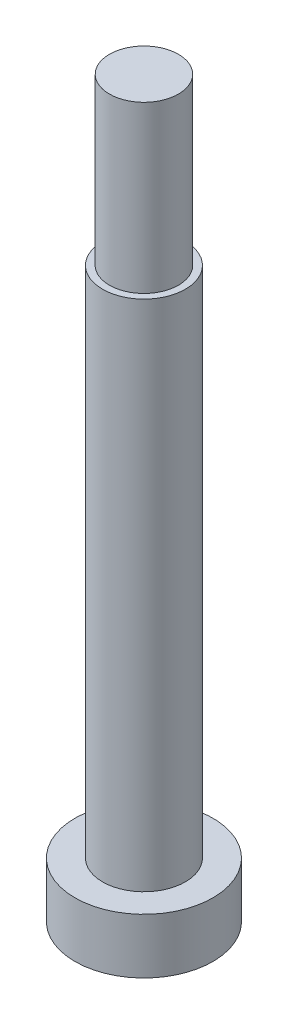
ISO-10303-21;
HEADER;
FILE_DESCRIPTION(('STEP AP214'),'2;1');
FILE_NAME('part.step','',(''),(''),'','','');
FILE_SCHEMA(('AUTOMOTIVE_DESIGN { 1 0 10303 214 1 1 1 1 }'));
ENDSEC;
DATA;
#1=APPLICATION_CONTEXT('core data for automotive mechanical design processes');
#2=APPLICATION_PROTOCOL_DEFINITION('international standard','automotive_design',2000,#1);
#3=PRODUCT_CONTEXT('',#1,'mechanical');
#4=PRODUCT('Part','Part','',(#3));
#5=PRODUCT_RELATED_PRODUCT_CATEGORY('part','',(#4));
#6=PRODUCT_DEFINITION_FORMATION('','',#4);
#7=PRODUCT_DEFINITION_CONTEXT('part definition',#1,'design');
#8=PRODUCT_DEFINITION('design','',#6,#7);
#9=PRODUCT_DEFINITION_SHAPE('','',#8);
#10=(LENGTH_UNIT() NAMED_UNIT(*) SI_UNIT(.MILLI.,.METRE.));
#11=(NAMED_UNIT(*) PLANE_ANGLE_UNIT() SI_UNIT($,.RADIAN.));
#12=(NAMED_UNIT(*) SI_UNIT($,.STERADIAN.) SOLID_ANGLE_UNIT());
#13=UNCERTAINTY_MEASURE_WITH_UNIT(LENGTH_MEASURE(1.E-05),#10,'distance_accuracy_value','');
#14=(GEOMETRIC_REPRESENTATION_CONTEXT(3) GLOBAL_UNCERTAINTY_ASSIGNED_CONTEXT((#13)) GLOBAL_UNIT_ASSIGNED_CONTEXT((#10,
#11,#12)) REPRESENTATION_CONTEXT('',''));
#15=CARTESIAN_POINT('',(0.,0.,0.));
#16=DIRECTION('',(0.,0.,1.));
#17=DIRECTION('',(1.,0.,0.));
#18=AXIS2_PLACEMENT_3D('',#15,#16,#17);
#19=CARTESIAN_POINT('',(5.0035,3.0035,5.0035));
#20=DIRECTION('',(0.,1.,0.));
#21=DIRECTION('',(0.,0.,1.));
#22=AXIS2_PLACEMENT_3D('',#19,#20,#21);
#23=PLANE('',#22);
#24=DIRECTION('',(-1.,0.,0.));
#25=VECTOR('',#24,1.);
#26=CARTESIAN_POINT('',(3.848799461621,3.0035,7.0035));
#27=LINE('',#26,#25);
#28=CARTESIAN_POINT('',(3.84879946162116,3.0035,7.00349999999991));
#29=VERTEX_POINT('',#28);
#30=CARTESIAN_POINT('',(6.158200538379,3.0035,7.0035));
#31=VERTEX_POINT('',#30);
#32=EDGE_CURVE('E84',#29,#31,#27,.F.);
#33=ORIENTED_EDGE('',*,*,#32,.F.);
#34=DIRECTION('',(-0.50000000000019,0.,-0.866025403784329));
#35=VECTOR('',#34,1.);
#36=CARTESIAN_POINT('',(2.694098923242,3.0035,5.0035));
#37=LINE('',#36,#35);
#38=CARTESIAN_POINT('',(2.69409892324184,3.0035,5.00349999999991));
#39=VERTEX_POINT('',#38);
#40=EDGE_CURVE('E134',#39,#29,#37,.F.);
#41=ORIENTED_EDGE('',*,*,#40,.F.);
#42=DIRECTION('',(0.50000000000019,0.,-0.866025403784329));
#43=VECTOR('',#42,1.);
#44=CARTESIAN_POINT('',(3.848799461621,3.0035,3.0035));
#45=LINE('',#44,#43);
#46=CARTESIAN_POINT('',(3.848799461621,3.0035,3.0035));
#47=VERTEX_POINT('',#46);
#48=EDGE_CURVE('E128',#47,#39,#45,.F.);
#49=ORIENTED_EDGE('',*,*,#48,.F.);
#50=DIRECTION('',(1.,0.,0.));
#51=VECTOR('',#50,1.);
#52=CARTESIAN_POINT('',(6.158200538379,3.0035,3.0035));
#53=LINE('',#52,#51);
#54=CARTESIAN_POINT('',(6.15820053837906,3.0035,3.00349999999996));
#55=VERTEX_POINT('',#54);
#56=EDGE_CURVE('E73',#55,#47,#53,.F.);
#57=ORIENTED_EDGE('',*,*,#56,.F.);
#58=DIRECTION('',(0.50000000000019,0.,0.866025403784329));
#59=VECTOR('',#58,1.);
#60=CARTESIAN_POINT('',(7.312901076759,3.0035,5.0035));
#61=LINE('',#60,#59);
#62=CARTESIAN_POINT('',(7.31290107675897,3.0035,5.00349999999998));
#63=VERTEX_POINT('',#62);
#64=EDGE_CURVE('E70',#63,#55,#61,.F.);
#65=ORIENTED_EDGE('',*,*,#64,.F.);
#66=DIRECTION('',(-0.50000000000019,0.,0.866025403784329));
#67=VECTOR('',#66,1.);
#68=CARTESIAN_POINT('',(6.158200538379,3.0035,7.0035));
#69=LINE('',#68,#67);
#70=EDGE_CURVE('E67',#31,#63,#69,.F.);
#71=ORIENTED_EDGE('',*,*,#70,.F.);
#72=EDGE_LOOP('',(#33,#41,#49,#57,#65,#71));
#73=FACE_BOUND('',#72,.T.);
#74=ADVANCED_FACE('F16',(#73),#23,.F.);
#75=CARTESIAN_POINT('',(7.312901076759,0.003499999999917,5.0035));
#76=DIRECTION('',(-0.866025403784329,0.,0.50000000000019));
#77=DIRECTION('',(0.50000000000019,0.,0.866025403784329));
#78=AXIS2_PLACEMENT_3D('',#75,#76,#77);
#79=PLANE('',#78);
#80=DIRECTION('',(0.,1.,0.));
#81=VECTOR('',#80,1.);
#82=CARTESIAN_POINT('',(6.158200538379,0.003499999999917,3.0035));
#83=LINE('',#82,#81);
#84=CARTESIAN_POINT('',(6.15820053837906,0.00349999999995975,3.00349999999996));
#85=VERTEX_POINT('',#84);
#86=EDGE_CURVE('E124',#85,#55,#83,.T.);
#87=ORIENTED_EDGE('',*,*,#86,.F.);
#88=DIRECTION('',(0.500000000000243,0.,0.866025403784298));
#89=VECTOR('',#88,1.);
#90=CARTESIAN_POINT('',(6.158200538379,0.003499999999917,3.0035));
#91=LINE('',#90,#89);
#92=CARTESIAN_POINT('',(7.31290107675897,0.00349999999995975,5.00349999999998));
#93=VERTEX_POINT('',#92);
#94=EDGE_CURVE('E81',#85,#93,#91,.T.);
#95=ORIENTED_EDGE('',*,*,#94,.T.);
#96=DIRECTION('',(0.,1.,0.));
#97=VECTOR('',#96,1.);
#98=CARTESIAN_POINT('',(7.31290107675888,0.003499999999917,5.00349999999993));
#99=LINE('',#98,#97);
#100=EDGE_CURVE('E78',#63,#93,#99,.F.);
#101=ORIENTED_EDGE('',*,*,#100,.F.);
#102=ORIENTED_EDGE('',*,*,#64,.T.);
#103=EDGE_LOOP('',(#87,#95,#101,#102));
#104=FACE_BOUND('',#103,.T.);
#105=ADVANCED_FACE('F79',(#104),#79,.T.);
#106=CARTESIAN_POINT('',(6.158200538379,0.003499999999917,7.0035));
#107=DIRECTION('',(-0.866025403784329,0.,-0.50000000000019));
#108=DIRECTION('',(-0.50000000000019,0.,0.866025403784329));
#109=AXIS2_PLACEMENT_3D('',#106,#107,#108);
#110=PLANE('',#109);
#111=ORIENTED_EDGE('',*,*,#100,.T.);
#112=DIRECTION('',(-0.500000000000243,0.,0.866025403784298));
#113=VECTOR('',#112,1.);
#114=CARTESIAN_POINT('',(7.312901076759,0.003499999999917,5.0035));
#115=LINE('',#114,#113);
#116=CARTESIAN_POINT('',(6.158200538379,0.00349999999995975,7.0035));
#117=VERTEX_POINT('',#116);
#118=EDGE_CURVE('E118',#93,#117,#115,.T.);
#119=ORIENTED_EDGE('',*,*,#118,.T.);
#120=DIRECTION('',(0.,1.,0.));
#121=VECTOR('',#120,1.);
#122=CARTESIAN_POINT('',(6.158200538379,0.003499999999917,7.0035));
#123=LINE('',#122,#121);
#124=EDGE_CURVE('E88',#31,#117,#123,.F.);
#125=ORIENTED_EDGE('',*,*,#124,.F.);
#126=ORIENTED_EDGE('',*,*,#70,.T.);
#127=EDGE_LOOP('',(#111,#119,#125,#126));
#128=FACE_BOUND('',#127,.T.);
#129=ADVANCED_FACE('F86',(#128),#110,.T.);
#130=CARTESIAN_POINT('',(3.848799461621,0.003499999999917,7.0035));
#131=DIRECTION('',(0.,0.,-1.));
#132=DIRECTION('',(-1.,0.,0.));
#133=AXIS2_PLACEMENT_3D('',#130,#131,#132);
#134=PLANE('',#133);
#135=ORIENTED_EDGE('',*,*,#124,.T.);
#136=DIRECTION('',(1.,0.,0.));
#137=VECTOR('',#136,1.);
#138=CARTESIAN_POINT('',(5.0035,0.003499999999917,7.0035));
#139=LINE('',#138,#137);
#140=CARTESIAN_POINT('',(3.84879946162116,0.00349999999995975,7.00349999999991));
#141=VERTEX_POINT('',#140);
#142=EDGE_CURVE('E116',#117,#141,#139,.F.);
#143=ORIENTED_EDGE('',*,*,#142,.T.);
#144=DIRECTION('',(0.,1.,0.));
#145=VECTOR('',#144,1.);
#146=CARTESIAN_POINT('',(3.84879946162163,0.003499999999917,7.00349999999964));
#147=LINE('',#146,#145);
#148=EDGE_CURVE('E131',#29,#141,#147,.F.);
#149=ORIENTED_EDGE('',*,*,#148,.F.);
#150=ORIENTED_EDGE('',*,*,#32,.T.);
#151=EDGE_LOOP('',(#135,#143,#149,#150));
#152=FACE_BOUND('',#151,.T.);
#153=ADVANCED_FACE('F139',(#152),#134,.T.);
#154=CARTESIAN_POINT('',(2.694098923242,0.003499999999917,5.0035));
#155=DIRECTION('',(0.866025403784329,0.,-0.50000000000019));
#156=DIRECTION('',(-0.50000000000019,0.,-0.866025403784329));
#157=AXIS2_PLACEMENT_3D('',#154,#155,#156);
#158=PLANE('',#157);
#159=ORIENTED_EDGE('',*,*,#148,.T.);
#160=DIRECTION('',(-0.499999999999918,0.,-0.866025403784486));
#161=VECTOR('',#160,1.);
#162=CARTESIAN_POINT('',(3.848799461621,0.003499999999917,7.0035));
#163=LINE('',#162,#161);
#164=CARTESIAN_POINT('',(2.69409892324184,0.00349999999995975,5.00349999999991));
#165=VERTEX_POINT('',#164);
#166=EDGE_CURVE('E112',#141,#165,#163,.T.);
#167=ORIENTED_EDGE('',*,*,#166,.T.);
#168=DIRECTION('',(0.,1.,0.));
#169=VECTOR('',#168,1.);
#170=CARTESIAN_POINT('',(2.69409892324137,0.003499999999917,5.00349999999964));
#171=LINE('',#170,#169);
#172=EDGE_CURVE('E126',#39,#165,#171,.F.);
#173=ORIENTED_EDGE('',*,*,#172,.F.);
#174=ORIENTED_EDGE('',*,*,#40,.T.);
#175=EDGE_LOOP('',(#159,#167,#173,#174));
#176=FACE_BOUND('',#175,.T.);
#177=ADVANCED_FACE('F143',(#176),#158,.T.);
#178=CARTESIAN_POINT('',(3.848799461621,0.003499999999917,3.0035));
#179=DIRECTION('',(0.866025403784329,0.,0.50000000000019));
#180=DIRECTION('',(0.50000000000019,0.,-0.866025403784329));
#181=AXIS2_PLACEMENT_3D('',#178,#179,#180);
#182=PLANE('',#181);
#183=ORIENTED_EDGE('',*,*,#172,.T.);
#184=DIRECTION('',(0.499999999999918,0.,-0.866025403784486));
#185=VECTOR('',#184,1.);
#186=CARTESIAN_POINT('',(2.694098923242,0.003499999999917,5.0035));
#187=LINE('',#186,#185);
#188=CARTESIAN_POINT('',(3.848799461621,0.00349999999995975,3.0035));
#189=VERTEX_POINT('',#188);
#190=EDGE_CURVE('E34',#165,#189,#187,.T.);
#191=ORIENTED_EDGE('',*,*,#190,.T.);
#192=DIRECTION('',(0.,1.,0.));
#193=VECTOR('',#192,1.);
#194=CARTESIAN_POINT('',(3.848799461621,0.003499999999917,3.0035));
#195=LINE('',#194,#193);
#196=EDGE_CURVE('E121',#47,#189,#195,.F.);
#197=ORIENTED_EDGE('',*,*,#196,.F.);
#198=ORIENTED_EDGE('',*,*,#48,.T.);
#199=EDGE_LOOP('',(#183,#191,#197,#198));
#200=FACE_BOUND('',#199,.T.);
#201=ADVANCED_FACE('F145',(#200),#182,.T.);
#202=CARTESIAN_POINT('',(6.158200538379,0.003499999999917,3.0035));
#203=DIRECTION('',(0.,0.,1.));
#204=DIRECTION('',(1.,0.,0.));
#205=AXIS2_PLACEMENT_3D('',#202,#203,#204);
#206=PLANE('',#205);
#207=ORIENTED_EDGE('',*,*,#196,.T.);
#208=DIRECTION('',(1.,0.,0.));
#209=VECTOR('',#208,1.);
#210=CARTESIAN_POINT('',(5.0035,0.003499999999917,3.0035));
#211=LINE('',#210,#209);
#212=EDGE_CURVE('E105',#189,#85,#211,.T.);
#213=ORIENTED_EDGE('',*,*,#212,.T.);
#214=ORIENTED_EDGE('',*,*,#86,.T.);
#215=ORIENTED_EDGE('',*,*,#56,.T.);
#216=EDGE_LOOP('',(#207,#213,#214,#215));
#217=FACE_BOUND('',#216,.T.);
#218=ADVANCED_FACE('F146',(#217),#206,.T.);
#219=CARTESIAN_POINT('',(5.0035,53.2035,5.0035));
#220=DIRECTION('',(0.,1.,0.));
#221=DIRECTION('',(0.,0.,1.));
#222=AXIS2_PLACEMENT_3D('',#219,#220,#221);
#223=PLANE('',#222);
#224=CARTESIAN_POINT('',(5.0035,53.2035,5.0035));
#225=DIRECTION('',(0.,1.,0.));
#226=DIRECTION('',(0.,0.,1.));
#227=AXIS2_PLACEMENT_3D('',#224,#225,#226);
#228=CIRCLE('',#227,2.5);
#229=CARTESIAN_POINT('',(5.0035,53.2035,7.5035));
#230=VERTEX_POINT('',#229);
#231=EDGE_CURVE('E19',#230,#230,#228,.F.);
#232=ORIENTED_EDGE('',*,*,#231,.F.);
#233=EDGE_LOOP('',(#232));
#234=FACE_BOUND('',#233,.T.);
#235=ADVANCED_FACE('F148',(#234),#223,.T.);
#236=CARTESIAN_POINT('',(5.0035,0.003499999999917,5.0035));
#237=DIRECTION('',(0.,1.,0.));
#238=DIRECTION('',(0.,0.,1.));
#239=AXIS2_PLACEMENT_3D('',#236,#237,#238);
#240=PLANE('',#239);
#241=ORIENTED_EDGE('',*,*,#190,.F.);
#242=ORIENTED_EDGE('',*,*,#166,.F.);
#243=ORIENTED_EDGE('',*,*,#142,.F.);
#244=ORIENTED_EDGE('',*,*,#118,.F.);
#245=ORIENTED_EDGE('',*,*,#94,.F.);
#246=ORIENTED_EDGE('',*,*,#212,.F.);
#247=EDGE_LOOP('',(#241,#242,#243,#244,#245,#246));
#248=FACE_BOUND('',#247,.T.);
#249=CARTESIAN_POINT('',(5.0035,0.003499999999974,5.0035));
#250=DIRECTION('',(0.,1.,0.));
#251=DIRECTION('',(0.,0.,1.));
#252=AXIS2_PLACEMENT_3D('',#249,#250,#251);
#253=CIRCLE('',#252,5.);
#254=CARTESIAN_POINT('',(5.0035,0.003499999999974,10.0035));
#255=VERTEX_POINT('',#254);
#256=EDGE_CURVE('E100',#255,#255,#253,.T.);
#257=ORIENTED_EDGE('',*,*,#256,.F.);
#258=EDGE_LOOP('',(#257));
#259=FACE_BOUND('',#258,.T.);
#260=ADVANCED_FACE('F155',(#248,#259),#240,.F.);
#261=CARTESIAN_POINT('',(5.0035,41.2035,5.0035));
#262=DIRECTION('',(0.,1.,0.));
#263=DIRECTION('',(0.,0.,1.));
#264=AXIS2_PLACEMENT_3D('',#261,#262,#263);
#265=CYLINDRICAL_SURFACE('',#264,2.5);
#266=CARTESIAN_POINT('',(5.0035,41.2035,5.0035));
#267=DIRECTION('',(0.,1.,0.));
#268=DIRECTION('',(0.,0.,1.));
#269=AXIS2_PLACEMENT_3D('',#266,#267,#268);
#270=CIRCLE('',#269,2.5);
#271=CARTESIAN_POINT('',(5.0035,41.2035,7.5035));
#272=VERTEX_POINT('',#271);
#273=EDGE_CURVE('E98',#272,#272,#270,.F.);
#274=ORIENTED_EDGE('',*,*,#273,.F.);
#275=EDGE_LOOP('',(#274));
#276=FACE_BOUND('',#275,.T.);
#277=ORIENTED_EDGE('',*,*,#231,.T.);
#278=EDGE_LOOP('',(#277));
#279=FACE_BOUND('',#278,.T.);
#280=ADVANCED_FACE('F178',(#276,#279),#265,.T.);
#281=CARTESIAN_POINT('',(5.0035,0.003499999999917,5.0035));
#282=DIRECTION('',(0.,1.,0.));
#283=DIRECTION('',(0.,0.,1.));
#284=AXIS2_PLACEMENT_3D('',#281,#282,#283);
#285=CYLINDRICAL_SURFACE('',#284,5.);
#286=ORIENTED_EDGE('',*,*,#256,.T.);
#287=EDGE_LOOP('',(#286));
#288=FACE_BOUND('',#287,.T.);
#289=CARTESIAN_POINT('',(5.0035,4.0035,5.0035));
#290=DIRECTION('',(0.,1.,0.));
#291=DIRECTION('',(0.,0.,1.));
#292=AXIS2_PLACEMENT_3D('',#289,#290,#291);
#293=CIRCLE('',#292,5.);
#294=CARTESIAN_POINT('',(5.0035,4.0035,10.0035));
#295=VERTEX_POINT('',#294);
#296=EDGE_CURVE('E95',#295,#295,#293,.T.);
#297=ORIENTED_EDGE('',*,*,#296,.F.);
#298=EDGE_LOOP('',(#297));
#299=FACE_BOUND('',#298,.T.);
#300=ADVANCED_FACE('F174',(#288,#299),#285,.T.);
#301=CARTESIAN_POINT('',(5.0035,41.2035,5.0035));
#302=DIRECTION('',(0.,1.,0.));
#303=DIRECTION('',(0.,0.,1.));
#304=AXIS2_PLACEMENT_3D('',#301,#302,#303);
#305=PLANE('',#304);
#306=ORIENTED_EDGE('',*,*,#273,.T.);
#307=EDGE_LOOP('',(#306));
#308=FACE_BOUND('',#307,.T.);
#309=CARTESIAN_POINT('',(5.0035,41.2035,5.0035));
#310=DIRECTION('',(0.,1.,0.));
#311=DIRECTION('',(0.,0.,1.));
#312=AXIS2_PLACEMENT_3D('',#309,#310,#311);
#313=CIRCLE('',#312,3.);
#314=CARTESIAN_POINT('',(5.0035,41.2035,8.0035));
#315=VERTEX_POINT('',#314);
#316=EDGE_CURVE('E25',#315,#315,#313,.F.);
#317=ORIENTED_EDGE('',*,*,#316,.F.);
#318=EDGE_LOOP('',(#317));
#319=FACE_BOUND('',#318,.T.);
#320=ADVANCED_FACE('F167',(#308,#319),#305,.T.);
#321=CARTESIAN_POINT('',(5.0035,4.0035,5.0035));
#322=DIRECTION('',(0.,1.,0.));
#323=DIRECTION('',(0.,0.,1.));
#324=AXIS2_PLACEMENT_3D('',#321,#322,#323);
#325=PLANE('',#324);
#326=CARTESIAN_POINT('',(5.0035,4.0035,5.0035));
#327=DIRECTION('',(0.,1.,0.));
#328=DIRECTION('',(0.,0.,1.));
#329=AXIS2_PLACEMENT_3D('',#326,#327,#328);
#330=CIRCLE('',#329,3.);
#331=CARTESIAN_POINT('',(5.0035,4.0035,8.0035));
#332=VERTEX_POINT('',#331);
#333=EDGE_CURVE('E11',#332,#332,#330,.T.);
#334=ORIENTED_EDGE('',*,*,#333,.F.);
#335=EDGE_LOOP('',(#334));
#336=FACE_BOUND('',#335,.T.);
#337=ORIENTED_EDGE('',*,*,#296,.T.);
#338=EDGE_LOOP('',(#337));
#339=FACE_BOUND('',#338,.T.);
#340=ADVANCED_FACE('F161',(#336,#339),#325,.T.);
#341=CARTESIAN_POINT('',(5.0035,4.0035,5.0035));
#342=DIRECTION('',(0.,1.,0.));
#343=DIRECTION('',(0.,0.,1.));
#344=AXIS2_PLACEMENT_3D('',#341,#342,#343);
#345=CYLINDRICAL_SURFACE('',#344,3.);
#346=ORIENTED_EDGE('',*,*,#333,.T.);
#347=EDGE_LOOP('',(#346));
#348=FACE_BOUND('',#347,.T.);
#349=ORIENTED_EDGE('',*,*,#316,.T.);
#350=EDGE_LOOP('',(#349));
#351=FACE_BOUND('',#350,.T.);
#352=ADVANCED_FACE('F159',(#348,#351),#345,.T.);
#353=CLOSED_SHELL('',(#74,#105,#129,#153,#177,#201,#218,#235,#260,#280,#300,#320,#340,#352));
#354=MANIFOLD_SOLID_BREP('B1',#353);
#355=ADVANCED_BREP_SHAPE_REPRESENTATION('',(#18,#354),#14);
#356=SHAPE_DEFINITION_REPRESENTATION(#9,#355);
ENDSEC;
END-ISO-10303-21;
